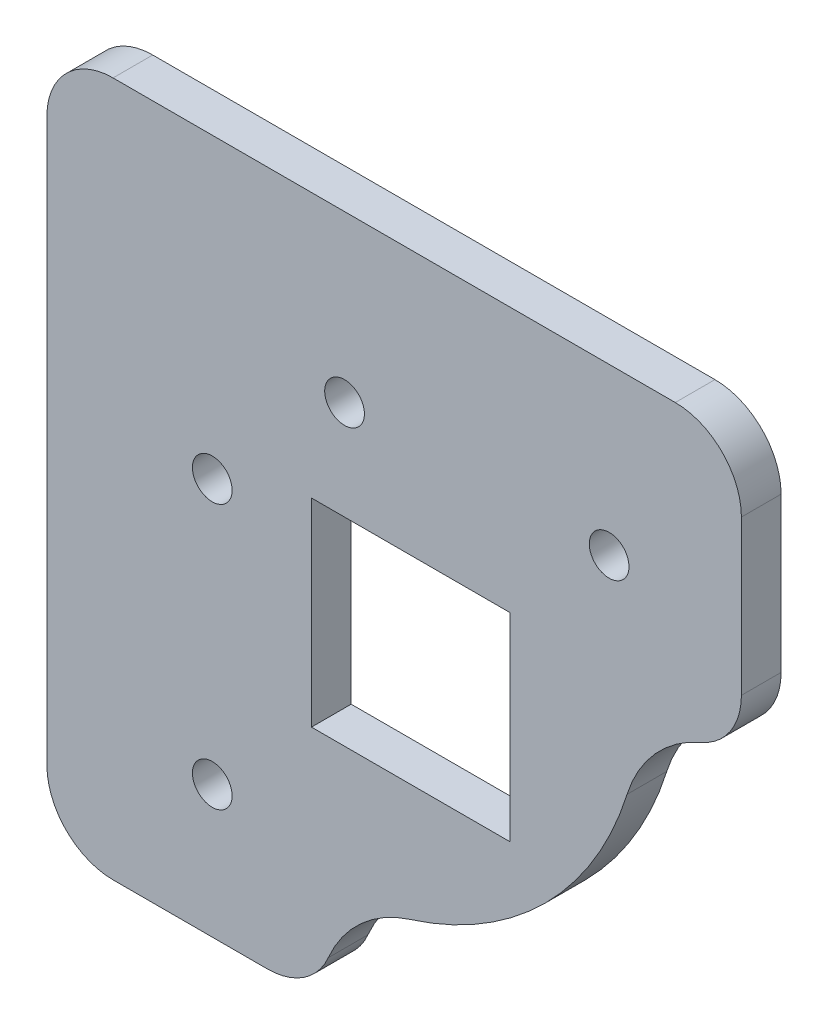
ISO-10303-21;
HEADER;
FILE_DESCRIPTION(('STEP AP214'),'2;1');
FILE_NAME('part.step','',(''),(''),'','','');
FILE_SCHEMA(('AUTOMOTIVE_DESIGN { 1 0 10303 214 1 1 1 1 }'));
ENDSEC;
DATA;
#1=APPLICATION_CONTEXT('core data for automotive mechanical design processes');
#2=APPLICATION_PROTOCOL_DEFINITION('international standard','automotive_design',2000,#1);
#3=PRODUCT_CONTEXT('',#1,'mechanical');
#4=PRODUCT('Part','Part','',(#3));
#5=PRODUCT_RELATED_PRODUCT_CATEGORY('part','',(#4));
#6=PRODUCT_DEFINITION_FORMATION('','',#4);
#7=PRODUCT_DEFINITION_CONTEXT('part definition',#1,'design');
#8=PRODUCT_DEFINITION('design','',#6,#7);
#9=PRODUCT_DEFINITION_SHAPE('','',#8);
#10=(LENGTH_UNIT() NAMED_UNIT(*) SI_UNIT(.MILLI.,.METRE.));
#11=(NAMED_UNIT(*) PLANE_ANGLE_UNIT() SI_UNIT($,.RADIAN.));
#12=(NAMED_UNIT(*) SI_UNIT($,.STERADIAN.) SOLID_ANGLE_UNIT());
#13=UNCERTAINTY_MEASURE_WITH_UNIT(LENGTH_MEASURE(1.E-05),#10,'distance_accuracy_value','');
#14=(GEOMETRIC_REPRESENTATION_CONTEXT(3) GLOBAL_UNCERTAINTY_ASSIGNED_CONTEXT((#13)) GLOBAL_UNIT_ASSIGNED_CONTEXT((#10,
#11,#12)) REPRESENTATION_CONTEXT('',''));
#15=CARTESIAN_POINT('',(0.,0.,0.));
#16=DIRECTION('',(0.,0.,1.));
#17=DIRECTION('',(1.,0.,0.));
#18=AXIS2_PLACEMENT_3D('',#15,#16,#17);
#19=CARTESIAN_POINT('',(53.4006252133016,-30.4593611353924,3.));
#20=DIRECTION('',(0.,0.,1.));
#21=DIRECTION('',(1.,0.,0.));
#22=AXIS2_PLACEMENT_3D('',#19,#20,#21);
#23=PLANE('',#22);
#24=CARTESIAN_POINT('',(22.5,-12.5,3.));
#25=DIRECTION('',(0.,0.,1.));
#26=DIRECTION('',(1.,0.,0.));
#27=AXIS2_PLACEMENT_3D('',#24,#25,#26);
#28=CIRCLE('',#27,1.5);
#29=CARTESIAN_POINT('',(24.,-12.5,3.));
#30=VERTEX_POINT('',#29);
#31=EDGE_CURVE('E535',#30,#30,#28,.T.);
#32=ORIENTED_EDGE('',*,*,#31,.F.);
#33=EDGE_LOOP('',(#32));
#34=FACE_BOUND('',#33,.T.);
#35=DIRECTION('',(1.,0.,0.));
#36=VECTOR('',#35,1.);
#37=CARTESIAN_POINT('',(20.,-35.,3.));
#38=LINE('',#37,#36);
#39=CARTESIAN_POINT('',(20.,-35.,3.));
#40=VERTEX_POINT('',#39);
#41=CARTESIAN_POINT('',(35.,-35.,3.));
#42=VERTEX_POINT('',#41);
#43=EDGE_CURVE('E163',#40,#42,#38,.T.);
#44=ORIENTED_EDGE('',*,*,#43,.F.);
#45=DIRECTION('',(0.,-1.,0.));
#46=VECTOR('',#45,1.);
#47=CARTESIAN_POINT('',(20.,-20.,3.));
#48=LINE('',#47,#46);
#49=CARTESIAN_POINT('',(20.,-20.,3.));
#50=VERTEX_POINT('',#49);
#51=EDGE_CURVE('E153',#50,#40,#48,.T.);
#52=ORIENTED_EDGE('',*,*,#51,.F.);
#53=DIRECTION('',(-1.,0.,0.));
#54=VECTOR('',#53,1.);
#55=CARTESIAN_POINT('',(20.,-20.,3.));
#56=LINE('',#55,#54);
#57=CARTESIAN_POINT('',(35.,-20.,3.));
#58=VERTEX_POINT('',#57);
#59=EDGE_CURVE('E179',#58,#50,#56,.T.);
#60=ORIENTED_EDGE('',*,*,#59,.F.);
#61=DIRECTION('',(0.,1.,0.));
#62=VECTOR('',#61,1.);
#63=CARTESIAN_POINT('',(35.,-20.,3.));
#64=LINE('',#63,#62);
#65=EDGE_CURVE('E177',#42,#58,#64,.T.);
#66=ORIENTED_EDGE('',*,*,#65,.F.);
#67=EDGE_LOOP('',(#44,#52,#60,#66));
#68=FACE_BOUND('',#67,.T.);
#69=CARTESIAN_POINT('',(12.5,-42.5,3.));
#70=DIRECTION('',(0.,0.,1.));
#71=DIRECTION('',(-1.,0.,0.));
#72=AXIS2_PLACEMENT_3D('',#69,#70,#71);
#73=CIRCLE('',#72,1.5);
#74=CARTESIAN_POINT('',(11.,-42.5,3.));
#75=VERTEX_POINT('',#74);
#76=EDGE_CURVE('E197',#75,#75,#73,.T.);
#77=ORIENTED_EDGE('',*,*,#76,.F.);
#78=EDGE_LOOP('',(#77));
#79=FACE_BOUND('',#78,.T.);
#80=CARTESIAN_POINT('',(53.4006252133016,-30.4593611353924,3.));
#81=DIRECTION('',(0.,0.,-1.));
#82=DIRECTION('',(1.,0.,0.));
#83=AXIS2_PLACEMENT_3D('',#80,#81,#82);
#84=CIRCLE('',#83,10.);
#85=CARTESIAN_POINT('',(43.8575894380726,-27.470972239566,3.));
#86=VERTEX_POINT('',#85);
#87=CARTESIAN_POINT('',(49.4668750711006,-21.2655800949971,3.));
#88=VERTEX_POINT('',#87);
#89=EDGE_CURVE('E214',#86,#88,#84,.T.);
#90=ORIENTED_EDGE('',*,*,#89,.T.);
#91=CARTESIAN_POINT('',(47.5,-16.6686895747994,3.));
#92=DIRECTION('',(0.,0.,1.));
#93=DIRECTION('',(1.,0.,0.));
#94=AXIS2_PLACEMENT_3D('',#91,#92,#93);
#95=CIRCLE('',#94,5.);
#96=CARTESIAN_POINT('',(52.5,-16.6686895747994,3.));
#97=VERTEX_POINT('',#96);
#98=EDGE_CURVE('E267',#88,#97,#95,.T.);
#99=ORIENTED_EDGE('',*,*,#98,.T.);
#100=DIRECTION('',(0.,1.,0.));
#101=VECTOR('',#100,1.);
#102=CARTESIAN_POINT('',(52.5,0.,3.));
#103=LINE('',#102,#101);
#104=CARTESIAN_POINT('',(52.5,-5.,3.));
#105=VERTEX_POINT('',#104);
#106=EDGE_CURVE('E217',#97,#105,#103,.T.);
#107=ORIENTED_EDGE('',*,*,#106,.T.);
#108=CARTESIAN_POINT('',(47.5,-5.,3.));
#109=DIRECTION('',(0.,0.,1.));
#110=DIRECTION('',(1.,0.,0.));
#111=AXIS2_PLACEMENT_3D('',#108,#109,#110);
#112=CIRCLE('',#111,5.);
#113=CARTESIAN_POINT('',(47.5,0.,3.));
#114=VERTEX_POINT('',#113);
#115=EDGE_CURVE('E59',#105,#114,#112,.T.);
#116=ORIENTED_EDGE('',*,*,#115,.T.);
#117=DIRECTION('',(-1.,0.,0.));
#118=VECTOR('',#117,1.);
#119=CARTESIAN_POINT('',(0.,0.,3.));
#120=LINE('',#119,#118);
#121=CARTESIAN_POINT('',(5.,0.,3.));
#122=VERTEX_POINT('',#121);
#123=EDGE_CURVE('E219',#114,#122,#120,.T.);
#124=ORIENTED_EDGE('',*,*,#123,.T.);
#125=CARTESIAN_POINT('',(5.,-5.,3.));
#126=DIRECTION('',(0.,0.,1.));
#127=DIRECTION('',(1.,0.,0.));
#128=AXIS2_PLACEMENT_3D('',#125,#126,#127);
#129=CIRCLE('',#128,5.);
#130=CARTESIAN_POINT('',(0.,-5.,3.));
#131=VERTEX_POINT('',#130);
#132=EDGE_CURVE('E264',#122,#131,#129,.T.);
#133=ORIENTED_EDGE('',*,*,#132,.T.);
#134=DIRECTION('',(0.,-1.,0.));
#135=VECTOR('',#134,1.);
#136=CARTESIAN_POINT('',(0.,-52.5,3.));
#137=LINE('',#136,#135);
#138=CARTESIAN_POINT('',(0.,-47.5,3.));
#139=VERTEX_POINT('',#138);
#140=EDGE_CURVE('E203',#131,#139,#137,.T.);
#141=ORIENTED_EDGE('',*,*,#140,.T.);
#142=CARTESIAN_POINT('',(5.,-47.5,3.));
#143=DIRECTION('',(0.,0.,1.));
#144=DIRECTION('',(1.,0.,0.));
#145=AXIS2_PLACEMENT_3D('',#142,#143,#144);
#146=CIRCLE('',#145,5.);
#147=CARTESIAN_POINT('',(5.,-52.5,3.));
#148=VERTEX_POINT('',#147);
#149=EDGE_CURVE('E262',#139,#148,#146,.T.);
#150=ORIENTED_EDGE('',*,*,#149,.T.);
#151=DIRECTION('',(1.,0.,0.));
#152=VECTOR('',#151,1.);
#153=CARTESIAN_POINT('',(20.5,-52.5,3.));
#154=LINE('',#153,#152);
#155=CARTESIAN_POINT('',(16.6686895747994,-52.5,3.));
#156=VERTEX_POINT('',#155);
#157=EDGE_CURVE('E206',#148,#156,#154,.T.);
#158=ORIENTED_EDGE('',*,*,#157,.T.);
#159=CARTESIAN_POINT('',(16.6686895747994,-47.5,3.));
#160=DIRECTION('',(0.,0.,1.));
#161=DIRECTION('',(1.,0.,0.));
#162=AXIS2_PLACEMENT_3D('',#159,#160,#161);
#163=CIRCLE('',#162,5.);
#164=CARTESIAN_POINT('',(21.2655800949971,-49.4668750711006,3.));
#165=VERTEX_POINT('',#164);
#166=EDGE_CURVE('E260',#156,#165,#163,.T.);
#167=ORIENTED_EDGE('',*,*,#166,.T.);
#168=CARTESIAN_POINT('',(30.4593611353924,-53.4006252133017,3.));
#169=DIRECTION('',(0.,0.,-1.));
#170=DIRECTION('',(-1.,0.,0.));
#171=AXIS2_PLACEMENT_3D('',#168,#169,#170);
#172=CIRCLE('',#171,10.);
#173=CARTESIAN_POINT('',(27.470972239566,-43.8575894380726,3.));
#174=VERTEX_POINT('',#173);
#175=EDGE_CURVE('E210',#165,#174,#172,.T.);
#176=ORIENTED_EDGE('',*,*,#175,.T.);
#177=CARTESIAN_POINT('',(20.,-20.,3.));
#178=DIRECTION('',(0.,0.,1.));
#179=DIRECTION('',(-1.,0.,0.));
#180=AXIS2_PLACEMENT_3D('',#177,#178,#179);
#181=CIRCLE('',#180,25.);
#182=EDGE_CURVE('E212',#174,#86,#181,.T.);
#183=ORIENTED_EDGE('',*,*,#182,.T.);
#184=EDGE_LOOP('',(#90,#99,#107,#116,#124,#133,#141,#150,#158,#167,#176,#183));
#185=FACE_BOUND('',#184,.T.);
#186=CARTESIAN_POINT('',(42.5,-12.5,3.));
#187=DIRECTION('',(0.,0.,1.));
#188=DIRECTION('',(1.,0.,0.));
#189=AXIS2_PLACEMENT_3D('',#186,#187,#188);
#190=CIRCLE('',#189,1.5);
#191=CARTESIAN_POINT('',(44.,-12.5,3.));
#192=VERTEX_POINT('',#191);
#193=EDGE_CURVE('E186',#192,#192,#190,.T.);
#194=ORIENTED_EDGE('',*,*,#193,.F.);
#195=EDGE_LOOP('',(#194));
#196=FACE_BOUND('',#195,.T.);
#197=CARTESIAN_POINT('',(12.5,-22.5,3.));
#198=DIRECTION('',(0.,0.,1.));
#199=DIRECTION('',(-1.,0.,0.));
#200=AXIS2_PLACEMENT_3D('',#197,#198,#199);
#201=CIRCLE('',#200,1.5);
#202=CARTESIAN_POINT('',(11.,-22.5,3.));
#203=VERTEX_POINT('',#202);
#204=EDGE_CURVE('E526',#203,#203,#201,.T.);
#205=ORIENTED_EDGE('',*,*,#204,.F.);
#206=EDGE_LOOP('',(#205));
#207=FACE_BOUND('',#206,.T.);
#208=ADVANCED_FACE('F37',(#34,#68,#79,#185,#196,#207),#23,.T.);
#209=CARTESIAN_POINT('',(53.4006252133016,-30.4593611353924,0.));
#210=DIRECTION('',(0.,0.,1.));
#211=DIRECTION('',(1.,0.,0.));
#212=AXIS2_PLACEMENT_3D('',#209,#210,#211);
#213=PLANE('',#212);
#214=CARTESIAN_POINT('',(12.5,-42.5,0.));
#215=DIRECTION('',(0.,0.,1.));
#216=DIRECTION('',(-1.,0.,0.));
#217=AXIS2_PLACEMENT_3D('',#214,#215,#216);
#218=CIRCLE('',#217,1.5);
#219=CARTESIAN_POINT('',(11.,-42.5,0.));
#220=VERTEX_POINT('',#219);
#221=EDGE_CURVE('E171',#220,#220,#218,.T.);
#222=ORIENTED_EDGE('',*,*,#221,.T.);
#223=EDGE_LOOP('',(#222));
#224=FACE_BOUND('',#223,.T.);
#225=DIRECTION('',(0.,1.,0.));
#226=VECTOR('',#225,1.);
#227=CARTESIAN_POINT('',(52.5,0.,0.));
#228=LINE('',#227,#226);
#229=CARTESIAN_POINT('',(52.5,-16.6686895747994,0.));
#230=VERTEX_POINT('',#229);
#231=CARTESIAN_POINT('',(52.5,-5.,0.));
#232=VERTEX_POINT('',#231);
#233=EDGE_CURVE('E234',#230,#232,#228,.T.);
#234=ORIENTED_EDGE('',*,*,#233,.F.);
#235=CARTESIAN_POINT('',(47.5,-16.6686895747994,0.));
#236=DIRECTION('',(0.,0.,1.));
#237=DIRECTION('',(1.,0.,0.));
#238=AXIS2_PLACEMENT_3D('',#235,#236,#237);
#239=CIRCLE('',#238,5.);
#240=CARTESIAN_POINT('',(49.4668750711006,-21.2655800949971,0.));
#241=VERTEX_POINT('',#240);
#242=EDGE_CURVE('E256',#230,#241,#239,.F.);
#243=ORIENTED_EDGE('',*,*,#242,.T.);
#244=CARTESIAN_POINT('',(53.4006252133016,-30.4593611353924,0.));
#245=DIRECTION('',(0.,0.,-1.));
#246=DIRECTION('',(1.,0.,0.));
#247=AXIS2_PLACEMENT_3D('',#244,#245,#246);
#248=CIRCLE('',#247,10.);
#249=CARTESIAN_POINT('',(43.8575894380726,-27.470972239566,0.));
#250=VERTEX_POINT('',#249);
#251=EDGE_CURVE('E231',#250,#241,#248,.T.);
#252=ORIENTED_EDGE('',*,*,#251,.F.);
#253=CARTESIAN_POINT('',(20.,-20.,0.));
#254=DIRECTION('',(0.,0.,1.));
#255=DIRECTION('',(-1.,0.,0.));
#256=AXIS2_PLACEMENT_3D('',#253,#254,#255);
#257=CIRCLE('',#256,25.);
#258=CARTESIAN_POINT('',(27.470972239566,-43.8575894380726,0.));
#259=VERTEX_POINT('',#258);
#260=EDGE_CURVE('E229',#259,#250,#257,.T.);
#261=ORIENTED_EDGE('',*,*,#260,.F.);
#262=CARTESIAN_POINT('',(30.4593611353924,-53.4006252133017,0.));
#263=DIRECTION('',(0.,0.,-1.));
#264=DIRECTION('',(-1.,0.,0.));
#265=AXIS2_PLACEMENT_3D('',#262,#263,#264);
#266=CIRCLE('',#265,10.);
#267=CARTESIAN_POINT('',(21.2655800949971,-49.4668750711006,0.));
#268=VERTEX_POINT('',#267);
#269=EDGE_CURVE('E227',#268,#259,#266,.T.);
#270=ORIENTED_EDGE('',*,*,#269,.F.);
#271=CARTESIAN_POINT('',(16.6686895747994,-47.5,0.));
#272=DIRECTION('',(0.,0.,1.));
#273=DIRECTION('',(1.,0.,0.));
#274=AXIS2_PLACEMENT_3D('',#271,#272,#273);
#275=CIRCLE('',#274,5.);
#276=CARTESIAN_POINT('',(16.6686895747994,-52.5,0.));
#277=VERTEX_POINT('',#276);
#278=EDGE_CURVE('E248',#268,#277,#275,.F.);
#279=ORIENTED_EDGE('',*,*,#278,.T.);
#280=DIRECTION('',(1.,0.,0.));
#281=VECTOR('',#280,1.);
#282=CARTESIAN_POINT('',(20.5,-52.5,0.));
#283=LINE('',#282,#281);
#284=CARTESIAN_POINT('',(5.,-52.5,0.));
#285=VERTEX_POINT('',#284);
#286=EDGE_CURVE('E224',#285,#277,#283,.T.);
#287=ORIENTED_EDGE('',*,*,#286,.F.);
#288=CARTESIAN_POINT('',(5.,-47.5,0.));
#289=DIRECTION('',(0.,0.,1.));
#290=DIRECTION('',(1.,0.,0.));
#291=AXIS2_PLACEMENT_3D('',#288,#289,#290);
#292=CIRCLE('',#291,5.);
#293=CARTESIAN_POINT('',(0.,-47.5,0.));
#294=VERTEX_POINT('',#293);
#295=EDGE_CURVE('E250',#285,#294,#292,.F.);
#296=ORIENTED_EDGE('',*,*,#295,.T.);
#297=DIRECTION('',(0.,-1.,0.));
#298=VECTOR('',#297,1.);
#299=CARTESIAN_POINT('',(0.,-52.5,0.));
#300=LINE('',#299,#298);
#301=CARTESIAN_POINT('',(0.,-5.,0.));
#302=VERTEX_POINT('',#301);
#303=EDGE_CURVE('E200',#302,#294,#300,.T.);
#304=ORIENTED_EDGE('',*,*,#303,.F.);
#305=CARTESIAN_POINT('',(5.,-5.,0.));
#306=DIRECTION('',(0.,0.,1.));
#307=DIRECTION('',(1.,0.,0.));
#308=AXIS2_PLACEMENT_3D('',#305,#306,#307);
#309=CIRCLE('',#308,5.);
#310=CARTESIAN_POINT('',(5.,0.,0.));
#311=VERTEX_POINT('',#310);
#312=EDGE_CURVE('E252',#302,#311,#309,.F.);
#313=ORIENTED_EDGE('',*,*,#312,.T.);
#314=DIRECTION('',(-1.,0.,0.));
#315=VECTOR('',#314,1.);
#316=CARTESIAN_POINT('',(0.,0.,0.));
#317=LINE('',#316,#315);
#318=CARTESIAN_POINT('',(47.5,0.,0.));
#319=VERTEX_POINT('',#318);
#320=EDGE_CURVE('E207',#319,#311,#317,.T.);
#321=ORIENTED_EDGE('',*,*,#320,.F.);
#322=CARTESIAN_POINT('',(47.5,-5.,0.));
#323=DIRECTION('',(0.,0.,1.));
#324=DIRECTION('',(1.,0.,0.));
#325=AXIS2_PLACEMENT_3D('',#322,#323,#324);
#326=CIRCLE('',#325,5.);
#327=EDGE_CURVE('E254',#319,#232,#326,.F.);
#328=ORIENTED_EDGE('',*,*,#327,.T.);
#329=EDGE_LOOP('',(#234,#243,#252,#261,#270,#279,#287,#296,#304,#313,#321,#328));
#330=FACE_BOUND('',#329,.T.);
#331=DIRECTION('',(0.,-1.,0.));
#332=VECTOR('',#331,1.);
#333=CARTESIAN_POINT('',(20.,-20.,0.));
#334=LINE('',#333,#332);
#335=CARTESIAN_POINT('',(20.,-20.,0.));
#336=VERTEX_POINT('',#335);
#337=CARTESIAN_POINT('',(20.,-35.,0.));
#338=VERTEX_POINT('',#337);
#339=EDGE_CURVE('E184',#336,#338,#334,.T.);
#340=ORIENTED_EDGE('',*,*,#339,.T.);
#341=DIRECTION('',(1.,0.,0.));
#342=VECTOR('',#341,1.);
#343=CARTESIAN_POINT('',(20.,-35.,0.));
#344=LINE('',#343,#342);
#345=CARTESIAN_POINT('',(35.,-35.,0.));
#346=VERTEX_POINT('',#345);
#347=EDGE_CURVE('E170',#338,#346,#344,.T.);
#348=ORIENTED_EDGE('',*,*,#347,.T.);
#349=DIRECTION('',(0.,1.,0.));
#350=VECTOR('',#349,1.);
#351=CARTESIAN_POINT('',(35.,-20.,0.));
#352=LINE('',#351,#350);
#353=CARTESIAN_POINT('',(35.,-20.,0.));
#354=VERTEX_POINT('',#353);
#355=EDGE_CURVE('E188',#346,#354,#352,.T.);
#356=ORIENTED_EDGE('',*,*,#355,.T.);
#357=DIRECTION('',(-1.,0.,0.));
#358=VECTOR('',#357,1.);
#359=CARTESIAN_POINT('',(20.,-20.,0.));
#360=LINE('',#359,#358);
#361=EDGE_CURVE('E164',#354,#336,#360,.T.);
#362=ORIENTED_EDGE('',*,*,#361,.T.);
#363=EDGE_LOOP('',(#340,#348,#356,#362));
#364=FACE_BOUND('',#363,.T.);
#365=CARTESIAN_POINT('',(42.5,-12.5,0.));
#366=DIRECTION('',(0.,0.,1.));
#367=DIRECTION('',(1.,0.,0.));
#368=AXIS2_PLACEMENT_3D('',#365,#366,#367);
#369=CIRCLE('',#368,1.5);
#370=CARTESIAN_POINT('',(44.,-12.5,0.));
#371=VERTEX_POINT('',#370);
#372=EDGE_CURVE('E538',#371,#371,#369,.T.);
#373=ORIENTED_EDGE('',*,*,#372,.T.);
#374=EDGE_LOOP('',(#373));
#375=FACE_BOUND('',#374,.T.);
#376=CARTESIAN_POINT('',(22.5,-12.5,0.));
#377=DIRECTION('',(0.,0.,1.));
#378=DIRECTION('',(1.,0.,0.));
#379=AXIS2_PLACEMENT_3D('',#376,#377,#378);
#380=CIRCLE('',#379,1.5);
#381=CARTESIAN_POINT('',(24.,-12.5,0.));
#382=VERTEX_POINT('',#381);
#383=EDGE_CURVE('E532',#382,#382,#380,.T.);
#384=ORIENTED_EDGE('',*,*,#383,.T.);
#385=EDGE_LOOP('',(#384));
#386=FACE_BOUND('',#385,.T.);
#387=CARTESIAN_POINT('',(12.5,-22.5,0.));
#388=DIRECTION('',(0.,0.,1.));
#389=DIRECTION('',(-1.,0.,0.));
#390=AXIS2_PLACEMENT_3D('',#387,#388,#389);
#391=CIRCLE('',#390,1.5);
#392=CARTESIAN_POINT('',(11.,-22.5,0.));
#393=VERTEX_POINT('',#392);
#394=EDGE_CURVE('E529',#393,#393,#391,.T.);
#395=ORIENTED_EDGE('',*,*,#394,.T.);
#396=EDGE_LOOP('',(#395));
#397=FACE_BOUND('',#396,.T.);
#398=ADVANCED_FACE('F290',(#224,#330,#364,#375,#386,#397),#213,.F.);
#399=CARTESIAN_POINT('',(0.,-52.5,3.));
#400=DIRECTION('',(1.,0.,0.));
#401=DIRECTION('',(0.,0.,-1.));
#402=AXIS2_PLACEMENT_3D('',#399,#400,#401);
#403=PLANE('',#402);
#404=ORIENTED_EDGE('',*,*,#140,.F.);
#405=DIRECTION('',(0.,0.,-1.));
#406=VECTOR('',#405,1.);
#407=CARTESIAN_POINT('',(0.,-5.,3.));
#408=LINE('',#407,#406);
#409=EDGE_CURVE('E275',#131,#302,#408,.T.);
#410=ORIENTED_EDGE('',*,*,#409,.T.);
#411=ORIENTED_EDGE('',*,*,#303,.T.);
#412=DIRECTION('',(0.,0.,-1.));
#413=VECTOR('',#412,1.);
#414=CARTESIAN_POINT('',(0.,-47.5,3.));
#415=LINE('',#414,#413);
#416=EDGE_CURVE('E273',#294,#139,#415,.F.);
#417=ORIENTED_EDGE('',*,*,#416,.T.);
#418=EDGE_LOOP('',(#404,#410,#411,#417));
#419=FACE_BOUND('',#418,.T.);
#420=ADVANCED_FACE('F309',(#419),#403,.F.);
#421=CARTESIAN_POINT('',(20.5,-52.5,3.));
#422=DIRECTION('',(0.,1.,0.));
#423=DIRECTION('',(0.,0.,1.));
#424=AXIS2_PLACEMENT_3D('',#421,#422,#423);
#425=PLANE('',#424);
#426=ORIENTED_EDGE('',*,*,#157,.F.);
#427=DIRECTION('',(0.,0.,-1.));
#428=VECTOR('',#427,1.);
#429=CARTESIAN_POINT('',(5.,-52.5,3.));
#430=LINE('',#429,#428);
#431=EDGE_CURVE('E45',#148,#285,#430,.T.);
#432=ORIENTED_EDGE('',*,*,#431,.T.);
#433=ORIENTED_EDGE('',*,*,#286,.T.);
#434=DIRECTION('',(0.,0.,-1.));
#435=VECTOR('',#434,1.);
#436=CARTESIAN_POINT('',(16.6686895747994,-52.5,3.));
#437=LINE('',#436,#435);
#438=EDGE_CURVE('E278',#277,#156,#437,.F.);
#439=ORIENTED_EDGE('',*,*,#438,.T.);
#440=EDGE_LOOP('',(#426,#432,#433,#439));
#441=FACE_BOUND('',#440,.T.);
#442=ADVANCED_FACE('F284',(#441),#425,.F.);
#443=CARTESIAN_POINT('',(30.4593611353924,-53.4006252133017,3.));
#444=DIRECTION('',(0.,0.,-1.));
#445=DIRECTION('',(-1.,0.,0.));
#446=AXIS2_PLACEMENT_3D('',#443,#444,#445);
#447=CYLINDRICAL_SURFACE('',#446,10.);
#448=ORIENTED_EDGE('',*,*,#175,.F.);
#449=DIRECTION('',(0.,0.,-1.));
#450=VECTOR('',#449,1.);
#451=CARTESIAN_POINT('',(21.2655800949971,-49.4668750711006,3.));
#452=LINE('',#451,#450);
#453=EDGE_CURVE('E11',#165,#268,#452,.T.);
#454=ORIENTED_EDGE('',*,*,#453,.T.);
#455=ORIENTED_EDGE('',*,*,#269,.T.);
#456=DIRECTION('',(0.,0.,-1.));
#457=VECTOR('',#456,1.);
#458=CARTESIAN_POINT('',(27.470972239566,-43.8575894380726,3.));
#459=LINE('',#458,#457);
#460=EDGE_CURVE('E240',#174,#259,#459,.T.);
#461=ORIENTED_EDGE('',*,*,#460,.F.);
#462=EDGE_LOOP('',(#448,#454,#455,#461));
#463=FACE_BOUND('',#462,.T.);
#464=ADVANCED_FACE('F300',(#463),#447,.F.);
#465=CARTESIAN_POINT('',(20.,-20.,3.));
#466=DIRECTION('',(0.,0.,-1.));
#467=DIRECTION('',(-1.,0.,0.));
#468=AXIS2_PLACEMENT_3D('',#465,#466,#467);
#469=CYLINDRICAL_SURFACE('',#468,25.);
#470=ORIENTED_EDGE('',*,*,#260,.T.);
#471=DIRECTION('',(0.,0.,-1.));
#472=VECTOR('',#471,1.);
#473=CARTESIAN_POINT('',(43.8575894380726,-27.470972239566,3.));
#474=LINE('',#473,#472);
#475=EDGE_CURVE('E221',#86,#250,#474,.T.);
#476=ORIENTED_EDGE('',*,*,#475,.F.);
#477=ORIENTED_EDGE('',*,*,#182,.F.);
#478=ORIENTED_EDGE('',*,*,#460,.T.);
#479=EDGE_LOOP('',(#470,#476,#477,#478));
#480=FACE_BOUND('',#479,.T.);
#481=ADVANCED_FACE('F333',(#480),#469,.T.);
#482=CARTESIAN_POINT('',(53.4006252133016,-30.4593611353924,3.));
#483=DIRECTION('',(0.,0.,-1.));
#484=DIRECTION('',(-1.,0.,0.));
#485=AXIS2_PLACEMENT_3D('',#482,#483,#484);
#486=CYLINDRICAL_SURFACE('',#485,10.);
#487=ORIENTED_EDGE('',*,*,#251,.T.);
#488=DIRECTION('',(0.,0.,-1.));
#489=VECTOR('',#488,1.);
#490=CARTESIAN_POINT('',(49.4668750711006,-21.2655800949971,3.));
#491=LINE('',#490,#489);
#492=EDGE_CURVE('E258',#241,#88,#491,.F.);
#493=ORIENTED_EDGE('',*,*,#492,.T.);
#494=ORIENTED_EDGE('',*,*,#89,.F.);
#495=ORIENTED_EDGE('',*,*,#475,.T.);
#496=EDGE_LOOP('',(#487,#493,#494,#495));
#497=FACE_BOUND('',#496,.T.);
#498=ADVANCED_FACE('F330',(#497),#486,.F.);
#499=CARTESIAN_POINT('',(52.5,0.,3.));
#500=DIRECTION('',(-1.,0.,0.));
#501=DIRECTION('',(0.,-1.,0.));
#502=AXIS2_PLACEMENT_3D('',#499,#500,#501);
#503=PLANE('',#502);
#504=ORIENTED_EDGE('',*,*,#106,.F.);
#505=DIRECTION('',(0.,0.,-1.));
#506=VECTOR('',#505,1.);
#507=CARTESIAN_POINT('',(52.5,-16.6686895747994,3.));
#508=LINE('',#507,#506);
#509=EDGE_CURVE('E245',#97,#230,#508,.T.);
#510=ORIENTED_EDGE('',*,*,#509,.T.);
#511=ORIENTED_EDGE('',*,*,#233,.T.);
#512=DIRECTION('',(0.,0.,-1.));
#513=VECTOR('',#512,1.);
#514=CARTESIAN_POINT('',(52.5,-5.,3.));
#515=LINE('',#514,#513);
#516=EDGE_CURVE('E243',#232,#105,#515,.F.);
#517=ORIENTED_EDGE('',*,*,#516,.T.);
#518=EDGE_LOOP('',(#504,#510,#511,#517));
#519=FACE_BOUND('',#518,.T.);
#520=ADVANCED_FACE('F322',(#519),#503,.F.);
#521=CARTESIAN_POINT('',(0.,0.,3.));
#522=DIRECTION('',(0.,-1.,0.));
#523=DIRECTION('',(0.,0.,-1.));
#524=AXIS2_PLACEMENT_3D('',#521,#522,#523);
#525=PLANE('',#524);
#526=ORIENTED_EDGE('',*,*,#123,.F.);
#527=DIRECTION('',(0.,0.,-1.));
#528=VECTOR('',#527,1.);
#529=CARTESIAN_POINT('',(47.5,0.,3.));
#530=LINE('',#529,#528);
#531=EDGE_CURVE('E270',#114,#319,#530,.T.);
#532=ORIENTED_EDGE('',*,*,#531,.T.);
#533=ORIENTED_EDGE('',*,*,#320,.T.);
#534=DIRECTION('',(0.,0.,-1.));
#535=VECTOR('',#534,1.);
#536=CARTESIAN_POINT('',(5.,0.,3.));
#537=LINE('',#536,#535);
#538=EDGE_CURVE('E52',#311,#122,#537,.F.);
#539=ORIENTED_EDGE('',*,*,#538,.T.);
#540=EDGE_LOOP('',(#526,#532,#533,#539));
#541=FACE_BOUND('',#540,.T.);
#542=ADVANCED_FACE('F313',(#541),#525,.F.);
#543=CARTESIAN_POINT('',(12.5,-42.5,3.));
#544=DIRECTION('',(0.,0.,-1.));
#545=DIRECTION('',(-1.,0.,0.));
#546=AXIS2_PLACEMENT_3D('',#543,#544,#545);
#547=CYLINDRICAL_SURFACE('',#546,1.5);
#548=ORIENTED_EDGE('',*,*,#76,.T.);
#549=EDGE_LOOP('',(#548));
#550=FACE_BOUND('',#549,.T.);
#551=ORIENTED_EDGE('',*,*,#221,.F.);
#552=EDGE_LOOP('',(#551));
#553=FACE_BOUND('',#552,.T.);
#554=ADVANCED_FACE('F352',(#550,#553),#547,.F.);
#555=CARTESIAN_POINT('',(20.,-20.,3.));
#556=DIRECTION('',(1.,0.,0.));
#557=DIRECTION('',(0.,1.,0.));
#558=AXIS2_PLACEMENT_3D('',#555,#556,#557);
#559=PLANE('',#558);
#560=ORIENTED_EDGE('',*,*,#339,.F.);
#561=DIRECTION('',(0.,0.,-1.));
#562=VECTOR('',#561,1.);
#563=CARTESIAN_POINT('',(20.,-20.,3.));
#564=LINE('',#563,#562);
#565=EDGE_CURVE('E159',#50,#336,#564,.T.);
#566=ORIENTED_EDGE('',*,*,#565,.F.);
#567=ORIENTED_EDGE('',*,*,#51,.T.);
#568=DIRECTION('',(0.,0.,-1.));
#569=VECTOR('',#568,1.);
#570=CARTESIAN_POINT('',(20.,-35.,3.));
#571=LINE('',#570,#569);
#572=EDGE_CURVE('E156',#40,#338,#571,.T.);
#573=ORIENTED_EDGE('',*,*,#572,.T.);
#574=EDGE_LOOP('',(#560,#566,#567,#573));
#575=FACE_BOUND('',#574,.T.);
#576=ADVANCED_FACE('F155',(#575),#559,.T.);
#577=CARTESIAN_POINT('',(20.,-35.,3.));
#578=DIRECTION('',(0.,1.,0.));
#579=DIRECTION('',(0.,0.,1.));
#580=AXIS2_PLACEMENT_3D('',#577,#578,#579);
#581=PLANE('',#580);
#582=ORIENTED_EDGE('',*,*,#347,.F.);
#583=ORIENTED_EDGE('',*,*,#572,.F.);
#584=ORIENTED_EDGE('',*,*,#43,.T.);
#585=DIRECTION('',(0.,0.,-1.));
#586=VECTOR('',#585,1.);
#587=CARTESIAN_POINT('',(35.,-35.,3.));
#588=LINE('',#587,#586);
#589=EDGE_CURVE('E172',#42,#346,#588,.T.);
#590=ORIENTED_EDGE('',*,*,#589,.T.);
#591=EDGE_LOOP('',(#582,#583,#584,#590));
#592=FACE_BOUND('',#591,.T.);
#593=ADVANCED_FACE('F167',(#592),#581,.T.);
#594=CARTESIAN_POINT('',(35.,-20.,3.));
#595=DIRECTION('',(-1.,0.,0.));
#596=DIRECTION('',(0.,-1.,0.));
#597=AXIS2_PLACEMENT_3D('',#594,#595,#596);
#598=PLANE('',#597);
#599=ORIENTED_EDGE('',*,*,#355,.F.);
#600=ORIENTED_EDGE('',*,*,#589,.F.);
#601=ORIENTED_EDGE('',*,*,#65,.T.);
#602=DIRECTION('',(0.,0.,-1.));
#603=VECTOR('',#602,1.);
#604=CARTESIAN_POINT('',(35.,-20.,3.));
#605=LINE('',#604,#603);
#606=EDGE_CURVE('E194',#58,#354,#605,.T.);
#607=ORIENTED_EDGE('',*,*,#606,.T.);
#608=EDGE_LOOP('',(#599,#600,#601,#607));
#609=FACE_BOUND('',#608,.T.);
#610=ADVANCED_FACE('F384',(#609),#598,.T.);
#611=CARTESIAN_POINT('',(20.,-20.,3.));
#612=DIRECTION('',(0.,-1.,0.));
#613=DIRECTION('',(0.,0.,-1.));
#614=AXIS2_PLACEMENT_3D('',#611,#612,#613);
#615=PLANE('',#614);
#616=ORIENTED_EDGE('',*,*,#361,.F.);
#617=ORIENTED_EDGE('',*,*,#606,.F.);
#618=ORIENTED_EDGE('',*,*,#59,.T.);
#619=ORIENTED_EDGE('',*,*,#565,.T.);
#620=EDGE_LOOP('',(#616,#617,#618,#619));
#621=FACE_BOUND('',#620,.T.);
#622=ADVANCED_FACE('F391',(#621),#615,.T.);
#623=CARTESIAN_POINT('',(42.5,-12.5,3.));
#624=DIRECTION('',(0.,0.,-1.));
#625=DIRECTION('',(-1.,0.,0.));
#626=AXIS2_PLACEMENT_3D('',#623,#624,#625);
#627=CYLINDRICAL_SURFACE('',#626,1.5);
#628=ORIENTED_EDGE('',*,*,#193,.T.);
#629=EDGE_LOOP('',(#628));
#630=FACE_BOUND('',#629,.T.);
#631=ORIENTED_EDGE('',*,*,#372,.F.);
#632=EDGE_LOOP('',(#631));
#633=FACE_BOUND('',#632,.T.);
#634=ADVANCED_FACE('F399',(#630,#633),#627,.F.);
#635=CARTESIAN_POINT('',(22.5,-12.5,3.));
#636=DIRECTION('',(0.,0.,-1.));
#637=DIRECTION('',(-1.,0.,0.));
#638=AXIS2_PLACEMENT_3D('',#635,#636,#637);
#639=CYLINDRICAL_SURFACE('',#638,1.5);
#640=ORIENTED_EDGE('',*,*,#31,.T.);
#641=EDGE_LOOP('',(#640));
#642=FACE_BOUND('',#641,.T.);
#643=ORIENTED_EDGE('',*,*,#383,.F.);
#644=EDGE_LOOP('',(#643));
#645=FACE_BOUND('',#644,.T.);
#646=ADVANCED_FACE('F407',(#642,#645),#639,.F.);
#647=CARTESIAN_POINT('',(12.5,-22.5,3.));
#648=DIRECTION('',(0.,0.,-1.));
#649=DIRECTION('',(-1.,0.,0.));
#650=AXIS2_PLACEMENT_3D('',#647,#648,#649);
#651=CYLINDRICAL_SURFACE('',#650,1.5);
#652=ORIENTED_EDGE('',*,*,#204,.T.);
#653=EDGE_LOOP('',(#652));
#654=FACE_BOUND('',#653,.T.);
#655=ORIENTED_EDGE('',*,*,#394,.F.);
#656=EDGE_LOOP('',(#655));
#657=FACE_BOUND('',#656,.T.);
#658=ADVANCED_FACE('F415',(#654,#657),#651,.F.);
#659=CARTESIAN_POINT('',(47.5,-16.6686895747994,3.));
#660=DIRECTION('',(0.,0.,-1.));
#661=DIRECTION('',(-1.,0.,0.));
#662=AXIS2_PLACEMENT_3D('',#659,#660,#661);
#663=CYLINDRICAL_SURFACE('',#662,5.);
#664=ORIENTED_EDGE('',*,*,#98,.F.);
#665=ORIENTED_EDGE('',*,*,#492,.F.);
#666=ORIENTED_EDGE('',*,*,#242,.F.);
#667=ORIENTED_EDGE('',*,*,#509,.F.);
#668=EDGE_LOOP('',(#664,#665,#666,#667));
#669=FACE_BOUND('',#668,.T.);
#670=ADVANCED_FACE('F326',(#669),#663,.T.);
#671=CARTESIAN_POINT('',(47.5,-5.,3.));
#672=DIRECTION('',(0.,0.,-1.));
#673=DIRECTION('',(-1.,0.,0.));
#674=AXIS2_PLACEMENT_3D('',#671,#672,#673);
#675=CYLINDRICAL_SURFACE('',#674,5.);
#676=ORIENTED_EDGE('',*,*,#115,.F.);
#677=ORIENTED_EDGE('',*,*,#516,.F.);
#678=ORIENTED_EDGE('',*,*,#327,.F.);
#679=ORIENTED_EDGE('',*,*,#531,.F.);
#680=EDGE_LOOP('',(#676,#677,#678,#679));
#681=FACE_BOUND('',#680,.T.);
#682=ADVANCED_FACE('F318',(#681),#675,.T.);
#683=CARTESIAN_POINT('',(5.,-5.,3.));
#684=DIRECTION('',(0.,0.,-1.));
#685=DIRECTION('',(-1.,0.,0.));
#686=AXIS2_PLACEMENT_3D('',#683,#684,#685);
#687=CYLINDRICAL_SURFACE('',#686,5.);
#688=ORIENTED_EDGE('',*,*,#132,.F.);
#689=ORIENTED_EDGE('',*,*,#538,.F.);
#690=ORIENTED_EDGE('',*,*,#312,.F.);
#691=ORIENTED_EDGE('',*,*,#409,.F.);
#692=EDGE_LOOP('',(#688,#689,#690,#691));
#693=FACE_BOUND('',#692,.T.);
#694=ADVANCED_FACE('F316',(#693),#687,.T.);
#695=CARTESIAN_POINT('',(5.,-47.5,3.));
#696=DIRECTION('',(0.,0.,-1.));
#697=DIRECTION('',(-1.,0.,0.));
#698=AXIS2_PLACEMENT_3D('',#695,#696,#697);
#699=CYLINDRICAL_SURFACE('',#698,5.);
#700=ORIENTED_EDGE('',*,*,#149,.F.);
#701=ORIENTED_EDGE('',*,*,#416,.F.);
#702=ORIENTED_EDGE('',*,*,#295,.F.);
#703=ORIENTED_EDGE('',*,*,#431,.F.);
#704=EDGE_LOOP('',(#700,#701,#702,#703));
#705=FACE_BOUND('',#704,.T.);
#706=ADVANCED_FACE('F307',(#705),#699,.T.);
#707=CARTESIAN_POINT('',(16.6686895747994,-47.5,3.));
#708=DIRECTION('',(0.,0.,-1.));
#709=DIRECTION('',(-1.,0.,0.));
#710=AXIS2_PLACEMENT_3D('',#707,#708,#709);
#711=CYLINDRICAL_SURFACE('',#710,5.);
#712=ORIENTED_EDGE('',*,*,#166,.F.);
#713=ORIENTED_EDGE('',*,*,#438,.F.);
#714=ORIENTED_EDGE('',*,*,#278,.F.);
#715=ORIENTED_EDGE('',*,*,#453,.F.);
#716=EDGE_LOOP('',(#712,#713,#714,#715));
#717=FACE_BOUND('',#716,.T.);
#718=ADVANCED_FACE('F39',(#717),#711,.T.);
#719=CLOSED_SHELL('',(#208,#398,#420,#442,#464,#481,#498,#520,#542,#554,#576,#593,#610,#622,
#634,#646,#658,#670,#682,#694,#706,#718));
#720=MANIFOLD_SOLID_BREP('B2',#719);
#721=ADVANCED_BREP_SHAPE_REPRESENTATION('',(#18,#720),#14);
#722=SHAPE_DEFINITION_REPRESENTATION(#9,#721);
ENDSEC;
END-ISO-10303-21;
